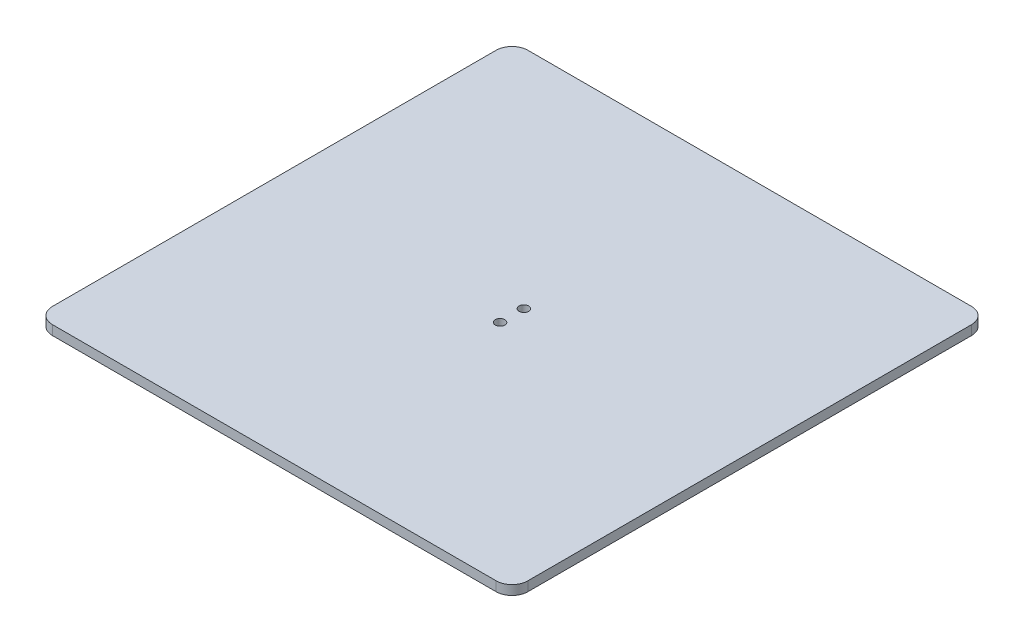
ISO-10303-21;
HEADER;
FILE_DESCRIPTION(('STEP AP214'),'2;1');
FILE_NAME('part.step','',(''),(''),'','','');
FILE_SCHEMA(('AUTOMOTIVE_DESIGN { 1 0 10303 214 1 1 1 1 }'));
ENDSEC;
DATA;
#1=APPLICATION_CONTEXT('core data for automotive mechanical design processes');
#2=APPLICATION_PROTOCOL_DEFINITION('international standard','automotive_design',2000,#1);
#3=PRODUCT_CONTEXT('',#1,'mechanical');
#4=PRODUCT('Part','Part','',(#3));
#5=PRODUCT_RELATED_PRODUCT_CATEGORY('part','',(#4));
#6=PRODUCT_DEFINITION_FORMATION('','',#4);
#7=PRODUCT_DEFINITION_CONTEXT('part definition',#1,'design');
#8=PRODUCT_DEFINITION('design','',#6,#7);
#9=PRODUCT_DEFINITION_SHAPE('','',#8);
#10=(LENGTH_UNIT() NAMED_UNIT(*) SI_UNIT(.MILLI.,.METRE.));
#11=(NAMED_UNIT(*) PLANE_ANGLE_UNIT() SI_UNIT($,.RADIAN.));
#12=(NAMED_UNIT(*) SI_UNIT($,.STERADIAN.) SOLID_ANGLE_UNIT());
#13=UNCERTAINTY_MEASURE_WITH_UNIT(LENGTH_MEASURE(1.E-05),#10,'distance_accuracy_value','');
#14=(GEOMETRIC_REPRESENTATION_CONTEXT(3) GLOBAL_UNCERTAINTY_ASSIGNED_CONTEXT((#13)) GLOBAL_UNIT_ASSIGNED_CONTEXT((#10,
#11,#12)) REPRESENTATION_CONTEXT('',''));
#15=CARTESIAN_POINT('',(0.,0.,0.));
#16=DIRECTION('',(0.,0.,1.));
#17=DIRECTION('',(1.,0.,0.));
#18=AXIS2_PLACEMENT_3D('',#15,#16,#17);
#19=CARTESIAN_POINT('',(0.,6.,0.));
#20=DIRECTION('',(0.,1.,0.));
#21=DIRECTION('',(0.,0.,1.));
#22=AXIS2_PLACEMENT_3D('',#19,#20,#21);
#23=PLANE('',#22);
#24=CARTESIAN_POINT('',(0.,6.,-7.5));
#25=DIRECTION('',(0.,1.,0.));
#26=DIRECTION('',(0.,0.,1.));
#27=AXIS2_PLACEMENT_3D('',#24,#25,#26);
#28=CIRCLE('',#27,3.);
#29=CARTESIAN_POINT('',(0.,6.,-4.5));
#30=VERTEX_POINT('',#29);
#31=EDGE_CURVE('E163',#30,#30,#28,.T.);
#32=ORIENTED_EDGE('',*,*,#31,.F.);
#33=EDGE_LOOP('',(#32));
#34=FACE_BOUND('',#33,.T.);
#35=DIRECTION('',(0.,0.,-1.));
#36=VECTOR('',#35,1.);
#37=CARTESIAN_POINT('',(150.,6.,-150.));
#38=LINE('',#37,#36);
#39=CARTESIAN_POINT('',(150.,6.,140.));
#40=VERTEX_POINT('',#39);
#41=CARTESIAN_POINT('',(150.,6.,-140.));
#42=VERTEX_POINT('',#41);
#43=EDGE_CURVE('E170',#40,#42,#38,.T.);
#44=ORIENTED_EDGE('',*,*,#43,.T.);
#45=CARTESIAN_POINT('',(140.,6.,-140.));
#46=DIRECTION('',(0.,1.,0.));
#47=DIRECTION('',(0.,0.,1.));
#48=AXIS2_PLACEMENT_3D('',#45,#46,#47);
#49=CIRCLE('',#48,10.);
#50=CARTESIAN_POINT('',(140.,6.,-150.));
#51=VERTEX_POINT('',#50);
#52=EDGE_CURVE('E147',#42,#51,#49,.T.);
#53=ORIENTED_EDGE('',*,*,#52,.T.);
#54=DIRECTION('',(-1.,0.,0.));
#55=VECTOR('',#54,1.);
#56=CARTESIAN_POINT('',(-150.,6.,-150.));
#57=LINE('',#56,#55);
#58=CARTESIAN_POINT('',(-140.,6.,-150.));
#59=VERTEX_POINT('',#58);
#60=EDGE_CURVE('E118',#51,#59,#57,.T.);
#61=ORIENTED_EDGE('',*,*,#60,.T.);
#62=CARTESIAN_POINT('',(-140.,6.,-140.));
#63=DIRECTION('',(0.,1.,0.));
#64=DIRECTION('',(0.,0.,1.));
#65=AXIS2_PLACEMENT_3D('',#62,#63,#64);
#66=CIRCLE('',#65,10.);
#67=CARTESIAN_POINT('',(-150.,6.,-140.));
#68=VERTEX_POINT('',#67);
#69=EDGE_CURVE('E145',#59,#68,#66,.T.);
#70=ORIENTED_EDGE('',*,*,#69,.T.);
#71=DIRECTION('',(0.,0.,1.));
#72=VECTOR('',#71,1.);
#73=CARTESIAN_POINT('',(-150.,6.,-150.));
#74=LINE('',#73,#72);
#75=CARTESIAN_POINT('',(-150.,6.,140.));
#76=VERTEX_POINT('',#75);
#77=EDGE_CURVE('E125',#68,#76,#74,.T.);
#78=ORIENTED_EDGE('',*,*,#77,.T.);
#79=CARTESIAN_POINT('',(-140.,6.,140.));
#80=DIRECTION('',(0.,1.,0.));
#81=DIRECTION('',(0.,0.,1.));
#82=AXIS2_PLACEMENT_3D('',#79,#80,#81);
#83=CIRCLE('',#82,10.);
#84=CARTESIAN_POINT('',(-140.,6.,150.));
#85=VERTEX_POINT('',#84);
#86=EDGE_CURVE('E53',#76,#85,#83,.T.);
#87=ORIENTED_EDGE('',*,*,#86,.T.);
#88=DIRECTION('',(1.,0.,0.));
#89=VECTOR('',#88,1.);
#90=CARTESIAN_POINT('',(-150.,6.,150.));
#91=LINE('',#90,#89);
#92=CARTESIAN_POINT('',(140.,6.,150.));
#93=VERTEX_POINT('',#92);
#94=EDGE_CURVE('E128',#85,#93,#91,.T.);
#95=ORIENTED_EDGE('',*,*,#94,.T.);
#96=CARTESIAN_POINT('',(140.,6.,140.));
#97=DIRECTION('',(0.,1.,0.));
#98=DIRECTION('',(0.,0.,1.));
#99=AXIS2_PLACEMENT_3D('',#96,#97,#98);
#100=CIRCLE('',#99,10.);
#101=EDGE_CURVE('E142',#93,#40,#100,.T.);
#102=ORIENTED_EDGE('',*,*,#101,.T.);
#103=EDGE_LOOP('',(#44,#53,#61,#70,#78,#87,#95,#102));
#104=FACE_BOUND('',#103,.T.);
#105=CARTESIAN_POINT('',(0.,6.,7.5));
#106=DIRECTION('',(0.,1.,0.));
#107=DIRECTION('',(0.,0.,1.));
#108=AXIS2_PLACEMENT_3D('',#105,#106,#107);
#109=CIRCLE('',#108,3.);
#110=CARTESIAN_POINT('',(0.,6.,10.5));
#111=VERTEX_POINT('',#110);
#112=EDGE_CURVE('E175',#111,#111,#109,.T.);
#113=ORIENTED_EDGE('',*,*,#112,.F.);
#114=EDGE_LOOP('',(#113));
#115=FACE_BOUND('',#114,.T.);
#116=ADVANCED_FACE('F32',(#34,#104,#115),#23,.T.);
#117=CARTESIAN_POINT('',(0.,0.,0.));
#118=DIRECTION('',(0.,1.,0.));
#119=DIRECTION('',(0.,0.,1.));
#120=AXIS2_PLACEMENT_3D('',#117,#118,#119);
#121=PLANE('',#120);
#122=DIRECTION('',(-1.,0.,0.));
#123=VECTOR('',#122,1.);
#124=CARTESIAN_POINT('',(-150.,0.,-150.));
#125=LINE('',#124,#123);
#126=CARTESIAN_POINT('',(140.,0.,-150.));
#127=VERTEX_POINT('',#126);
#128=CARTESIAN_POINT('',(-140.,0.,-150.));
#129=VERTEX_POINT('',#128);
#130=EDGE_CURVE('E115',#127,#129,#125,.T.);
#131=ORIENTED_EDGE('',*,*,#130,.F.);
#132=CARTESIAN_POINT('',(140.,0.,-140.));
#133=DIRECTION('',(0.,1.,0.));
#134=DIRECTION('',(0.,0.,1.));
#135=AXIS2_PLACEMENT_3D('',#132,#133,#134);
#136=CIRCLE('',#135,10.);
#137=CARTESIAN_POINT('',(150.,0.,-140.));
#138=VERTEX_POINT('',#137);
#139=EDGE_CURVE('E98',#127,#138,#136,.F.);
#140=ORIENTED_EDGE('',*,*,#139,.T.);
#141=DIRECTION('',(0.,0.,-1.));
#142=VECTOR('',#141,1.);
#143=CARTESIAN_POINT('',(150.,0.,-150.));
#144=LINE('',#143,#142);
#145=CARTESIAN_POINT('',(150.,0.,140.));
#146=VERTEX_POINT('',#145);
#147=EDGE_CURVE('E126',#146,#138,#144,.T.);
#148=ORIENTED_EDGE('',*,*,#147,.F.);
#149=CARTESIAN_POINT('',(140.,0.,140.));
#150=DIRECTION('',(0.,1.,0.));
#151=DIRECTION('',(0.,0.,1.));
#152=AXIS2_PLACEMENT_3D('',#149,#150,#151);
#153=CIRCLE('',#152,10.);
#154=CARTESIAN_POINT('',(140.,0.,150.));
#155=VERTEX_POINT('',#154);
#156=EDGE_CURVE('E119',#146,#155,#153,.F.);
#157=ORIENTED_EDGE('',*,*,#156,.T.);
#158=DIRECTION('',(1.,0.,0.));
#159=VECTOR('',#158,1.);
#160=CARTESIAN_POINT('',(-150.,0.,150.));
#161=LINE('',#160,#159);
#162=CARTESIAN_POINT('',(-140.,0.,150.));
#163=VERTEX_POINT('',#162);
#164=EDGE_CURVE('E130',#163,#155,#161,.T.);
#165=ORIENTED_EDGE('',*,*,#164,.F.);
#166=CARTESIAN_POINT('',(-140.,0.,140.));
#167=DIRECTION('',(0.,1.,0.));
#168=DIRECTION('',(0.,0.,1.));
#169=AXIS2_PLACEMENT_3D('',#166,#167,#168);
#170=CIRCLE('',#169,10.);
#171=CARTESIAN_POINT('',(-150.,0.,140.));
#172=VERTEX_POINT('',#171);
#173=EDGE_CURVE('E136',#163,#172,#170,.F.);
#174=ORIENTED_EDGE('',*,*,#173,.T.);
#175=DIRECTION('',(0.,0.,1.));
#176=VECTOR('',#175,1.);
#177=CARTESIAN_POINT('',(-150.,0.,-150.));
#178=LINE('',#177,#176);
#179=CARTESIAN_POINT('',(-150.,0.,-140.));
#180=VERTEX_POINT('',#179);
#181=EDGE_CURVE('E158',#180,#172,#178,.T.);
#182=ORIENTED_EDGE('',*,*,#181,.F.);
#183=CARTESIAN_POINT('',(-140.,0.,-140.));
#184=DIRECTION('',(0.,1.,0.));
#185=DIRECTION('',(0.,0.,1.));
#186=AXIS2_PLACEMENT_3D('',#183,#184,#185);
#187=CIRCLE('',#186,10.);
#188=EDGE_CURVE('E109',#180,#129,#187,.F.);
#189=ORIENTED_EDGE('',*,*,#188,.T.);
#190=EDGE_LOOP('',(#131,#140,#148,#157,#165,#174,#182,#189));
#191=FACE_BOUND('',#190,.T.);
#192=CARTESIAN_POINT('',(0.,0.,-7.5));
#193=DIRECTION('',(0.,1.,0.));
#194=DIRECTION('',(0.,0.,1.));
#195=AXIS2_PLACEMENT_3D('',#192,#193,#194);
#196=CIRCLE('',#195,3.);
#197=CARTESIAN_POINT('',(0.,0.,-4.5));
#198=VERTEX_POINT('',#197);
#199=EDGE_CURVE('E166',#198,#198,#196,.T.);
#200=ORIENTED_EDGE('',*,*,#199,.T.);
#201=EDGE_LOOP('',(#200));
#202=FACE_BOUND('',#201,.T.);
#203=CARTESIAN_POINT('',(0.,0.,7.5));
#204=DIRECTION('',(0.,1.,0.));
#205=DIRECTION('',(0.,0.,1.));
#206=AXIS2_PLACEMENT_3D('',#203,#204,#205);
#207=CIRCLE('',#206,3.);
#208=CARTESIAN_POINT('',(0.,0.,10.5));
#209=VERTEX_POINT('',#208);
#210=EDGE_CURVE('E177',#209,#209,#207,.T.);
#211=ORIENTED_EDGE('',*,*,#210,.T.);
#212=EDGE_LOOP('',(#211));
#213=FACE_BOUND('',#212,.T.);
#214=ADVANCED_FACE('F122',(#191,#202,#213),#121,.F.);
#215=CARTESIAN_POINT('',(-150.,6.,-150.));
#216=DIRECTION('',(1.,0.,0.));
#217=DIRECTION('',(0.,0.,-1.));
#218=AXIS2_PLACEMENT_3D('',#215,#216,#217);
#219=PLANE('',#218);
#220=ORIENTED_EDGE('',*,*,#77,.F.);
#221=DIRECTION('',(0.,-1.,0.));
#222=VECTOR('',#221,1.);
#223=CARTESIAN_POINT('',(-150.,6.,-140.));
#224=LINE('',#223,#222);
#225=EDGE_CURVE('E151',#68,#180,#224,.T.);
#226=ORIENTED_EDGE('',*,*,#225,.T.);
#227=ORIENTED_EDGE('',*,*,#181,.T.);
#228=DIRECTION('',(0.,-1.,0.));
#229=VECTOR('',#228,1.);
#230=CARTESIAN_POINT('',(-150.,6.,140.));
#231=LINE('',#230,#229);
#232=EDGE_CURVE('E149',#172,#76,#231,.F.);
#233=ORIENTED_EDGE('',*,*,#232,.T.);
#234=EDGE_LOOP('',(#220,#226,#227,#233));
#235=FACE_BOUND('',#234,.T.);
#236=ADVANCED_FACE('F157',(#235),#219,.F.);
#237=CARTESIAN_POINT('',(-150.,6.,150.));
#238=DIRECTION('',(0.,0.,-1.));
#239=DIRECTION('',(-1.,0.,0.));
#240=AXIS2_PLACEMENT_3D('',#237,#238,#239);
#241=PLANE('',#240);
#242=ORIENTED_EDGE('',*,*,#94,.F.);
#243=DIRECTION('',(0.,-1.,0.));
#244=VECTOR('',#243,1.);
#245=CARTESIAN_POINT('',(-140.,6.,150.));
#246=LINE('',#245,#244);
#247=EDGE_CURVE('E11',#85,#163,#246,.T.);
#248=ORIENTED_EDGE('',*,*,#247,.T.);
#249=ORIENTED_EDGE('',*,*,#164,.T.);
#250=DIRECTION('',(0.,-1.,0.));
#251=VECTOR('',#250,1.);
#252=CARTESIAN_POINT('',(140.,6.,150.));
#253=LINE('',#252,#251);
#254=EDGE_CURVE('E40',#155,#93,#253,.F.);
#255=ORIENTED_EDGE('',*,*,#254,.T.);
#256=EDGE_LOOP('',(#242,#248,#249,#255));
#257=FACE_BOUND('',#256,.T.);
#258=ADVANCED_FACE('F203',(#257),#241,.F.);
#259=CARTESIAN_POINT('',(150.,6.,-150.));
#260=DIRECTION('',(-1.,0.,0.));
#261=DIRECTION('',(0.,0.,1.));
#262=AXIS2_PLACEMENT_3D('',#259,#260,#261);
#263=PLANE('',#262);
#264=ORIENTED_EDGE('',*,*,#147,.T.);
#265=DIRECTION('',(0.,-1.,0.));
#266=VECTOR('',#265,1.);
#267=CARTESIAN_POINT('',(150.,6.,-140.));
#268=LINE('',#267,#266);
#269=EDGE_CURVE('E103',#138,#42,#268,.F.);
#270=ORIENTED_EDGE('',*,*,#269,.T.);
#271=ORIENTED_EDGE('',*,*,#43,.F.);
#272=DIRECTION('',(0.,-1.,0.));
#273=VECTOR('',#272,1.);
#274=CARTESIAN_POINT('',(150.,6.,140.));
#275=LINE('',#274,#273);
#276=EDGE_CURVE('E108',#40,#146,#275,.T.);
#277=ORIENTED_EDGE('',*,*,#276,.T.);
#278=EDGE_LOOP('',(#264,#270,#271,#277));
#279=FACE_BOUND('',#278,.T.);
#280=ADVANCED_FACE('F200',(#279),#263,.F.);
#281=CARTESIAN_POINT('',(-150.,6.,-150.));
#282=DIRECTION('',(0.,0.,1.));
#283=DIRECTION('',(1.,0.,0.));
#284=AXIS2_PLACEMENT_3D('',#281,#282,#283);
#285=PLANE('',#284);
#286=ORIENTED_EDGE('',*,*,#60,.F.);
#287=DIRECTION('',(0.,-1.,0.));
#288=VECTOR('',#287,1.);
#289=CARTESIAN_POINT('',(140.,6.,-150.));
#290=LINE('',#289,#288);
#291=EDGE_CURVE('E102',#51,#127,#290,.T.);
#292=ORIENTED_EDGE('',*,*,#291,.T.);
#293=ORIENTED_EDGE('',*,*,#130,.T.);
#294=DIRECTION('',(0.,-1.,0.));
#295=VECTOR('',#294,1.);
#296=CARTESIAN_POINT('',(-140.,6.,-150.));
#297=LINE('',#296,#295);
#298=EDGE_CURVE('E120',#129,#59,#297,.F.);
#299=ORIENTED_EDGE('',*,*,#298,.T.);
#300=EDGE_LOOP('',(#286,#292,#293,#299));
#301=FACE_BOUND('',#300,.T.);
#302=ADVANCED_FACE('F114',(#301),#285,.F.);
#303=CARTESIAN_POINT('',(0.,6.,-7.5));
#304=DIRECTION('',(0.,-1.,0.));
#305=DIRECTION('',(0.,0.,-1.));
#306=AXIS2_PLACEMENT_3D('',#303,#304,#305);
#307=CYLINDRICAL_SURFACE('',#306,3.);
#308=ORIENTED_EDGE('',*,*,#31,.T.);
#309=EDGE_LOOP('',(#308));
#310=FACE_BOUND('',#309,.T.);
#311=ORIENTED_EDGE('',*,*,#199,.F.);
#312=EDGE_LOOP('',(#311));
#313=FACE_BOUND('',#312,.T.);
#314=ADVANCED_FACE('F195',(#310,#313),#307,.F.);
#315=CARTESIAN_POINT('',(0.,6.,7.5));
#316=DIRECTION('',(0.,-1.,0.));
#317=DIRECTION('',(0.,0.,-1.));
#318=AXIS2_PLACEMENT_3D('',#315,#316,#317);
#319=CYLINDRICAL_SURFACE('',#318,3.);
#320=ORIENTED_EDGE('',*,*,#112,.T.);
#321=EDGE_LOOP('',(#320));
#322=FACE_BOUND('',#321,.T.);
#323=ORIENTED_EDGE('',*,*,#210,.F.);
#324=EDGE_LOOP('',(#323));
#325=FACE_BOUND('',#324,.T.);
#326=ADVANCED_FACE('F183',(#322,#325),#319,.F.);
#327=CARTESIAN_POINT('',(140.,6.,-140.));
#328=DIRECTION('',(0.,-1.,0.));
#329=DIRECTION('',(0.,0.,-1.));
#330=AXIS2_PLACEMENT_3D('',#327,#328,#329);
#331=CYLINDRICAL_SURFACE('',#330,10.);
#332=ORIENTED_EDGE('',*,*,#52,.F.);
#333=ORIENTED_EDGE('',*,*,#269,.F.);
#334=ORIENTED_EDGE('',*,*,#139,.F.);
#335=ORIENTED_EDGE('',*,*,#291,.F.);
#336=EDGE_LOOP('',(#332,#333,#334,#335));
#337=FACE_BOUND('',#336,.T.);
#338=ADVANCED_FACE('F101',(#337),#331,.T.);
#339=CARTESIAN_POINT('',(-140.,6.,-140.));
#340=DIRECTION('',(0.,-1.,0.));
#341=DIRECTION('',(0.,0.,-1.));
#342=AXIS2_PLACEMENT_3D('',#339,#340,#341);
#343=CYLINDRICAL_SURFACE('',#342,10.);
#344=ORIENTED_EDGE('',*,*,#69,.F.);
#345=ORIENTED_EDGE('',*,*,#298,.F.);
#346=ORIENTED_EDGE('',*,*,#188,.F.);
#347=ORIENTED_EDGE('',*,*,#225,.F.);
#348=EDGE_LOOP('',(#344,#345,#346,#347));
#349=FACE_BOUND('',#348,.T.);
#350=ADVANCED_FACE('F211',(#349),#343,.T.);
#351=CARTESIAN_POINT('',(-140.,6.,140.));
#352=DIRECTION('',(0.,-1.,0.));
#353=DIRECTION('',(0.,0.,-1.));
#354=AXIS2_PLACEMENT_3D('',#351,#352,#353);
#355=CYLINDRICAL_SURFACE('',#354,10.);
#356=ORIENTED_EDGE('',*,*,#86,.F.);
#357=ORIENTED_EDGE('',*,*,#232,.F.);
#358=ORIENTED_EDGE('',*,*,#173,.F.);
#359=ORIENTED_EDGE('',*,*,#247,.F.);
#360=EDGE_LOOP('',(#356,#357,#358,#359));
#361=FACE_BOUND('',#360,.T.);
#362=ADVANCED_FACE('F213',(#361),#355,.T.);
#363=CARTESIAN_POINT('',(140.,6.,140.));
#364=DIRECTION('',(0.,-1.,0.));
#365=DIRECTION('',(0.,0.,-1.));
#366=AXIS2_PLACEMENT_3D('',#363,#364,#365);
#367=CYLINDRICAL_SURFACE('',#366,10.);
#368=ORIENTED_EDGE('',*,*,#101,.F.);
#369=ORIENTED_EDGE('',*,*,#254,.F.);
#370=ORIENTED_EDGE('',*,*,#156,.F.);
#371=ORIENTED_EDGE('',*,*,#276,.F.);
#372=EDGE_LOOP('',(#368,#369,#370,#371));
#373=FACE_BOUND('',#372,.T.);
#374=ADVANCED_FACE('F34',(#373),#367,.T.);
#375=CLOSED_SHELL('',(#116,#214,#236,#258,#280,#302,#314,#326,#338,#350,#362,#374));
#376=MANIFOLD_SOLID_BREP('B2',#375);
#377=ADVANCED_BREP_SHAPE_REPRESENTATION('',(#18,#376),#14);
#378=SHAPE_DEFINITION_REPRESENTATION(#9,#377);
ENDSEC;
END-ISO-10303-21;
